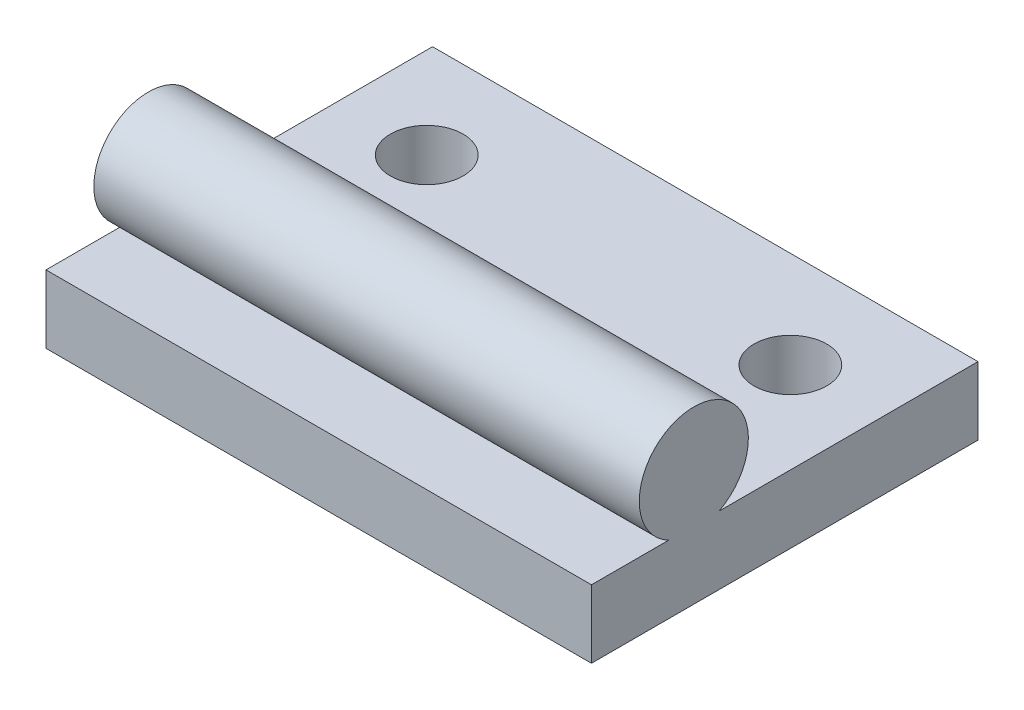
ISO-10303-21;
HEADER;
FILE_DESCRIPTION(('STEP AP214'),'2;1');
FILE_NAME('part.step','',(''),(''),'','','');
FILE_SCHEMA(('AUTOMOTIVE_DESIGN { 1 0 10303 214 1 1 1 1 }'));
ENDSEC;
DATA;
#1=APPLICATION_CONTEXT('core data for automotive mechanical design processes');
#2=APPLICATION_PROTOCOL_DEFINITION('international standard','automotive_design',2000,#1);
#3=PRODUCT_CONTEXT('',#1,'mechanical');
#4=PRODUCT('Part','Part','',(#3));
#5=PRODUCT_RELATED_PRODUCT_CATEGORY('part','',(#4));
#6=PRODUCT_DEFINITION_FORMATION('','',#4);
#7=PRODUCT_DEFINITION_CONTEXT('part definition',#1,'design');
#8=PRODUCT_DEFINITION('design','',#6,#7);
#9=PRODUCT_DEFINITION_SHAPE('','',#8);
#10=(LENGTH_UNIT() NAMED_UNIT(*) SI_UNIT(.MILLI.,.METRE.));
#11=(NAMED_UNIT(*) PLANE_ANGLE_UNIT() SI_UNIT($,.RADIAN.));
#12=(NAMED_UNIT(*) SI_UNIT($,.STERADIAN.) SOLID_ANGLE_UNIT());
#13=UNCERTAINTY_MEASURE_WITH_UNIT(LENGTH_MEASURE(1.E-05),#10,'distance_accuracy_value','');
#14=(GEOMETRIC_REPRESENTATION_CONTEXT(3) GLOBAL_UNCERTAINTY_ASSIGNED_CONTEXT((#13)) GLOBAL_UNIT_ASSIGNED_CONTEXT((#10,
#11,#12)) REPRESENTATION_CONTEXT('',''));
#15=CARTESIAN_POINT('',(0.,0.,0.));
#16=DIRECTION('',(0.,0.,1.));
#17=DIRECTION('',(1.,0.,0.));
#18=AXIS2_PLACEMENT_3D('',#15,#16,#17);
#19=CARTESIAN_POINT('',(0.,4.7498,0.));
#20=DIRECTION('',(0.,-1.,0.));
#21=DIRECTION('',(0.,0.,-1.));
#22=AXIS2_PLACEMENT_3D('',#19,#20,#21);
#23=PLANE('',#22);
#24=DIRECTION('',(0.,0.,-1.));
#25=VECTOR('',#24,1.);
#26=CARTESIAN_POINT('',(38.1,4.7498,0.));
#27=LINE('',#26,#25);
#28=CARTESIAN_POINT('',(38.1,4.7498,14.3002));
#29=VERTEX_POINT('',#28);
#30=CARTESIAN_POINT('',(38.1,4.7498,8.9120505477311));
#31=VERTEX_POINT('',#30);
#32=EDGE_CURVE('E58',#29,#31,#27,.T.);
#33=ORIENTED_EDGE('',*,*,#32,.T.);
#34=DIRECTION('',(-1.,0.,0.));
#35=VECTOR('',#34,1.);
#36=CARTESIAN_POINT('',(48.876307345283,4.7498,8.9120505477311));
#37=LINE('',#36,#35);
#38=CARTESIAN_POINT('',(0.,4.7498,8.91205054773111));
#39=VERTEX_POINT('',#38);
#40=EDGE_CURVE('E11',#31,#39,#37,.T.);
#41=ORIENTED_EDGE('',*,*,#40,.T.);
#42=DIRECTION('',(0.,0.,1.));
#43=VECTOR('',#42,1.);
#44=CARTESIAN_POINT('',(0.,4.7498,0.));
#45=LINE('',#44,#43);
#46=CARTESIAN_POINT('',(0.,4.7498,14.3002));
#47=VERTEX_POINT('',#46);
#48=EDGE_CURVE('E196',#39,#47,#45,.T.);
#49=ORIENTED_EDGE('',*,*,#48,.T.);
#50=DIRECTION('',(-1.,0.,0.));
#51=VECTOR('',#50,1.);
#52=CARTESIAN_POINT('',(0.,4.7498,14.3002));
#53=LINE('',#52,#51);
#54=EDGE_CURVE('E129',#29,#47,#53,.T.);
#55=ORIENTED_EDGE('',*,*,#54,.F.);
#56=EDGE_LOOP('',(#33,#41,#49,#55));
#57=FACE_BOUND('',#56,.T.);
#58=ADVANCED_FACE('F44',(#57),#23,.F.);
#59=CARTESIAN_POINT('',(0.,4.7498,0.));
#60=DIRECTION('',(1.,0.,0.));
#61=DIRECTION('',(0.,0.,-1.));
#62=AXIS2_PLACEMENT_3D('',#59,#60,#61);
#63=PLANE('',#62);
#64=ORIENTED_EDGE('',*,*,#48,.F.);
#65=CARTESIAN_POINT('',(0.,8.12791045813337,7.1501));
#66=DIRECTION('',(-1.,0.,0.));
#67=DIRECTION('',(0.,0.,1.));
#68=AXIS2_PLACEMENT_3D('',#65,#66,#67);
#69=CIRCLE('',#68,3.81);
#70=CARTESIAN_POINT('',(0.,4.7498,5.38814945226889));
#71=VERTEX_POINT('',#70);
#72=EDGE_CURVE('E118',#39,#71,#69,.T.);
#73=ORIENTED_EDGE('',*,*,#72,.T.);
#74=CARTESIAN_POINT('',(0.,4.7498,-12.7));
#75=VERTEX_POINT('',#74);
#76=EDGE_CURVE('E108',#75,#71,#45,.T.);
#77=ORIENTED_EDGE('',*,*,#76,.F.);
#78=DIRECTION('',(0.,-1.,0.));
#79=VECTOR('',#78,1.);
#80=CARTESIAN_POINT('',(0.,4.7498,-12.7));
#81=LINE('',#80,#79);
#82=CARTESIAN_POINT('',(0.,0.,-12.7));
#83=VERTEX_POINT('',#82);
#84=EDGE_CURVE('E206',#75,#83,#81,.T.);
#85=ORIENTED_EDGE('',*,*,#84,.T.);
#86=DIRECTION('',(0.,0.,1.));
#87=VECTOR('',#86,1.);
#88=CARTESIAN_POINT('',(0.,0.,0.));
#89=LINE('',#88,#87);
#90=CARTESIAN_POINT('',(0.,-5.96945777522548E-05,0.));
#91=VERTEX_POINT('',#90);
#92=EDGE_CURVE('E182',#83,#91,#89,.T.);
#93=ORIENTED_EDGE('',*,*,#92,.T.);
#94=DIRECTION('',(0.,0.,-1.));
#95=VECTOR('',#94,1.);
#96=CARTESIAN_POINT('',(0.,-0.00011938915550451,14.3002));
#97=LINE('',#96,#95);
#98=CARTESIAN_POINT('',(0.,-0.00011938915550451,14.3002));
#99=VERTEX_POINT('',#98);
#100=EDGE_CURVE('E145',#99,#91,#97,.T.);
#101=ORIENTED_EDGE('',*,*,#100,.F.);
#102=DIRECTION('',(0.,-1.,0.));
#103=VECTOR('',#102,1.);
#104=CARTESIAN_POINT('',(0.,4.7498,14.3002));
#105=LINE('',#104,#103);
#106=EDGE_CURVE('E117',#47,#99,#105,.T.);
#107=ORIENTED_EDGE('',*,*,#106,.F.);
#108=EDGE_LOOP('',(#64,#73,#77,#85,#93,#101,#107));
#109=FACE_BOUND('',#108,.T.);
#110=ADVANCED_FACE('F46',(#109),#63,.F.);
#111=CARTESIAN_POINT('',(38.1,4.7498,0.));
#112=DIRECTION('',(-1.,0.,0.));
#113=DIRECTION('',(0.,0.,1.));
#114=AXIS2_PLACEMENT_3D('',#111,#112,#113);
#115=PLANE('',#114);
#116=CARTESIAN_POINT('',(38.1,4.7498,5.38814945226889));
#117=VERTEX_POINT('',#116);
#118=CARTESIAN_POINT('',(38.1,4.7498,-12.7));
#119=VERTEX_POINT('',#118);
#120=EDGE_CURVE('E99',#117,#119,#27,.T.);
#121=ORIENTED_EDGE('',*,*,#120,.F.);
#122=CARTESIAN_POINT('',(38.1,8.12791045813337,7.15009999999999));
#123=DIRECTION('',(-1.,0.,0.));
#124=DIRECTION('',(0.,0.,1.));
#125=AXIS2_PLACEMENT_3D('',#122,#123,#124);
#126=CIRCLE('',#125,3.81);
#127=EDGE_CURVE('E103',#117,#31,#126,.F.);
#128=ORIENTED_EDGE('',*,*,#127,.T.);
#129=ORIENTED_EDGE('',*,*,#32,.F.);
#130=DIRECTION('',(0.,1.,0.));
#131=VECTOR('',#130,1.);
#132=CARTESIAN_POINT('',(38.1,4.7498,14.3002));
#133=LINE('',#132,#131);
#134=CARTESIAN_POINT('',(38.1,-0.00011938915550451,14.3002));
#135=VERTEX_POINT('',#134);
#136=EDGE_CURVE('E126',#135,#29,#133,.T.);
#137=ORIENTED_EDGE('',*,*,#136,.F.);
#138=DIRECTION('',(0.,0.,-1.));
#139=VECTOR('',#138,1.);
#140=CARTESIAN_POINT('',(38.1,-0.00011938915550451,14.3002));
#141=LINE('',#140,#139);
#142=CARTESIAN_POINT('',(38.1,-5.96945777522548E-05,0.));
#143=VERTEX_POINT('',#142);
#144=EDGE_CURVE('E132',#135,#143,#141,.T.);
#145=ORIENTED_EDGE('',*,*,#144,.T.);
#146=DIRECTION('',(0.,0.,-1.));
#147=VECTOR('',#146,1.);
#148=CARTESIAN_POINT('',(38.1,0.,0.));
#149=LINE('',#148,#147);
#150=CARTESIAN_POINT('',(38.1,0.,-12.7));
#151=VERTEX_POINT('',#150);
#152=EDGE_CURVE('E192',#143,#151,#149,.T.);
#153=ORIENTED_EDGE('',*,*,#152,.T.);
#154=DIRECTION('',(0.,-1.,0.));
#155=VECTOR('',#154,1.);
#156=CARTESIAN_POINT('',(38.1,4.7498,-12.7));
#157=LINE('',#156,#155);
#158=EDGE_CURVE('E105',#119,#151,#157,.T.);
#159=ORIENTED_EDGE('',*,*,#158,.F.);
#160=EDGE_LOOP('',(#121,#128,#129,#137,#145,#153,#159));
#161=FACE_BOUND('',#160,.T.);
#162=ADVANCED_FACE('F101',(#161),#115,.F.);
#163=CARTESIAN_POINT('',(0.,4.7498,-12.7));
#164=DIRECTION('',(0.,0.,1.));
#165=DIRECTION('',(1.,0.,0.));
#166=AXIS2_PLACEMENT_3D('',#163,#164,#165);
#167=PLANE('',#166);
#168=DIRECTION('',(-1.,0.,0.));
#169=VECTOR('',#168,1.);
#170=CARTESIAN_POINT('',(0.,0.,-12.7));
#171=LINE('',#170,#169);
#172=EDGE_CURVE('E194',#151,#83,#171,.T.);
#173=ORIENTED_EDGE('',*,*,#172,.T.);
#174=ORIENTED_EDGE('',*,*,#84,.F.);
#175=DIRECTION('',(-1.,0.,0.));
#176=VECTOR('',#175,1.);
#177=CARTESIAN_POINT('',(0.,4.7498,-12.7));
#178=LINE('',#177,#176);
#179=EDGE_CURVE('E205',#119,#75,#178,.T.);
#180=ORIENTED_EDGE('',*,*,#179,.F.);
#181=ORIENTED_EDGE('',*,*,#158,.T.);
#182=EDGE_LOOP('',(#173,#174,#180,#181));
#183=FACE_BOUND('',#182,.T.);
#184=ADVANCED_FACE('F170',(#183),#167,.F.);
#185=CARTESIAN_POINT('',(6.35,4.7498,-5.9436));
#186=DIRECTION('',(0.,1.,0.));
#187=DIRECTION('',(0.,0.,1.));
#188=AXIS2_PLACEMENT_3D('',#185,#186,#187);
#189=CIRCLE('',#188,2.54);
#190=CARTESIAN_POINT('',(6.35,4.7498,-3.4036));
#191=VERTEX_POINT('',#190);
#192=EDGE_CURVE('E219',#191,#191,#189,.T.);
#193=ORIENTED_EDGE('',*,*,#192,.F.);
#194=EDGE_LOOP('',(#193));
#195=FACE_BOUND('',#194,.T.);
#196=CARTESIAN_POINT('',(31.75,4.7498,-5.94360000000001));
#197=DIRECTION('',(0.,1.,0.));
#198=DIRECTION('',(0.,0.,1.));
#199=AXIS2_PLACEMENT_3D('',#196,#197,#198);
#200=CIRCLE('',#199,2.54);
#201=CARTESIAN_POINT('',(31.75,4.7498,-3.4036));
#202=VERTEX_POINT('',#201);
#203=EDGE_CURVE('E216',#202,#202,#200,.T.);
#204=ORIENTED_EDGE('',*,*,#203,.F.);
#205=EDGE_LOOP('',(#204));
#206=FACE_BOUND('',#205,.T.);
#207=ORIENTED_EDGE('',*,*,#76,.T.);
#208=DIRECTION('',(-1.,0.,0.));
#209=VECTOR('',#208,1.);
#210=CARTESIAN_POINT('',(48.876307345283,4.7498,5.38814945226889));
#211=LINE('',#210,#209);
#212=EDGE_CURVE('E52',#71,#117,#211,.F.);
#213=ORIENTED_EDGE('',*,*,#212,.T.);
#214=ORIENTED_EDGE('',*,*,#120,.T.);
#215=ORIENTED_EDGE('',*,*,#179,.T.);
#216=EDGE_LOOP('',(#207,#213,#214,#215));
#217=FACE_BOUND('',#216,.T.);
#218=ADVANCED_FACE('F111',(#195,#206,#217),#23,.F.);
#219=CARTESIAN_POINT('',(0.,0.,0.));
#220=DIRECTION('',(0.,-1.,0.));
#221=DIRECTION('',(0.,0.,-1.));
#222=AXIS2_PLACEMENT_3D('',#219,#220,#221);
#223=PLANE('',#222);
#224=CARTESIAN_POINT('',(6.35,0.,-5.9436));
#225=DIRECTION('',(0.,1.,0.));
#226=DIRECTION('',(0.,0.,1.));
#227=AXIS2_PLACEMENT_3D('',#224,#225,#226);
#228=CIRCLE('',#227,2.54);
#229=CARTESIAN_POINT('',(6.35,0.,-3.4036));
#230=VERTEX_POINT('',#229);
#231=EDGE_CURVE('E189',#230,#230,#228,.T.);
#232=ORIENTED_EDGE('',*,*,#231,.T.);
#233=EDGE_LOOP('',(#232));
#234=FACE_BOUND('',#233,.T.);
#235=CARTESIAN_POINT('',(31.75,0.,-5.94360000000001));
#236=DIRECTION('',(0.,1.,0.));
#237=DIRECTION('',(0.,0.,1.));
#238=AXIS2_PLACEMENT_3D('',#235,#236,#237);
#239=CIRCLE('',#238,2.54);
#240=CARTESIAN_POINT('',(31.75,0.,-3.4036));
#241=VERTEX_POINT('',#240);
#242=EDGE_CURVE('E213',#241,#241,#239,.T.);
#243=ORIENTED_EDGE('',*,*,#242,.T.);
#244=EDGE_LOOP('',(#243));
#245=FACE_BOUND('',#244,.T.);
#246=ORIENTED_EDGE('',*,*,#92,.F.);
#247=ORIENTED_EDGE('',*,*,#172,.F.);
#248=ORIENTED_EDGE('',*,*,#152,.F.);
#249=CARTESIAN_POINT('',(0.,-0.00011938915550451,0.));
#250=DIRECTION('',(1.,0.,0.));
#251=VECTOR('',#250,1.);
#252=LINE('',#249,#251);
#253=EDGE_CURVE('E139',#91,#143,#252,.T.);
#254=ORIENTED_EDGE('',*,*,#253,.F.);
#255=EDGE_LOOP('',(#246,#247,#248,#254));
#256=FACE_BOUND('',#255,.T.);
#257=ADVANCED_FACE('F166',(#234,#245,#256),#223,.T.);
#258=CARTESIAN_POINT('',(31.75,0.,-5.94360000000001));
#259=DIRECTION('',(0.,1.,0.));
#260=DIRECTION('',(0.,0.,1.));
#261=AXIS2_PLACEMENT_3D('',#258,#259,#260);
#262=CYLINDRICAL_SURFACE('',#261,2.54);
#263=ORIENTED_EDGE('',*,*,#242,.F.);
#264=EDGE_LOOP('',(#263));
#265=FACE_BOUND('',#264,.T.);
#266=ORIENTED_EDGE('',*,*,#203,.T.);
#267=EDGE_LOOP('',(#266));
#268=FACE_BOUND('',#267,.T.);
#269=ADVANCED_FACE('F162',(#265,#268),#262,.F.);
#270=CARTESIAN_POINT('',(6.35,0.,-5.9436));
#271=DIRECTION('',(0.,1.,0.));
#272=DIRECTION('',(0.,0.,1.));
#273=AXIS2_PLACEMENT_3D('',#270,#271,#272);
#274=CYLINDRICAL_SURFACE('',#273,2.54);
#275=ORIENTED_EDGE('',*,*,#231,.F.);
#276=EDGE_LOOP('',(#275));
#277=FACE_BOUND('',#276,.T.);
#278=ORIENTED_EDGE('',*,*,#192,.T.);
#279=EDGE_LOOP('',(#278));
#280=FACE_BOUND('',#279,.T.);
#281=ADVANCED_FACE('F158',(#277,#280),#274,.F.);
#282=CARTESIAN_POINT('',(0.,-0.00011938915550451,14.3002));
#283=DIRECTION('',(0.,1.,0.));
#284=DIRECTION('',(0.,0.,1.));
#285=AXIS2_PLACEMENT_3D('',#282,#283,#284);
#286=PLANE('',#285);
#287=ORIENTED_EDGE('',*,*,#253,.T.);
#288=ORIENTED_EDGE('',*,*,#144,.F.);
#289=DIRECTION('',(1.,0.,0.));
#290=VECTOR('',#289,1.);
#291=CARTESIAN_POINT('',(0.,-0.00011938915550451,14.3002));
#292=LINE('',#291,#290);
#293=EDGE_CURVE('E121',#99,#135,#292,.T.);
#294=ORIENTED_EDGE('',*,*,#293,.F.);
#295=ORIENTED_EDGE('',*,*,#100,.T.);
#296=EDGE_LOOP('',(#287,#288,#294,#295));
#297=FACE_BOUND('',#296,.T.);
#298=ADVANCED_FACE('F147',(#297),#286,.F.);
#299=CARTESIAN_POINT('',(0.,0.,14.3002));
#300=DIRECTION('',(0.,0.,1.));
#301=DIRECTION('',(1.,0.,0.));
#302=AXIS2_PLACEMENT_3D('',#299,#300,#301);
#303=PLANE('',#302);
#304=ORIENTED_EDGE('',*,*,#106,.T.);
#305=ORIENTED_EDGE('',*,*,#293,.T.);
#306=ORIENTED_EDGE('',*,*,#136,.T.);
#307=ORIENTED_EDGE('',*,*,#54,.T.);
#308=EDGE_LOOP('',(#304,#305,#306,#307));
#309=FACE_BOUND('',#308,.T.);
#310=ADVANCED_FACE('F157',(#309),#303,.T.);
#311=CARTESIAN_POINT('',(48.876307345283,8.12791045813337,7.15009999999999));
#312=DIRECTION('',(-1.,0.,0.));
#313=DIRECTION('',(0.,0.,1.));
#314=AXIS2_PLACEMENT_3D('',#311,#312,#313);
#315=CYLINDRICAL_SURFACE('',#314,3.81);
#316=ORIENTED_EDGE('',*,*,#40,.F.);
#317=ORIENTED_EDGE('',*,*,#127,.F.);
#318=ORIENTED_EDGE('',*,*,#212,.F.);
#319=ORIENTED_EDGE('',*,*,#72,.F.);
#320=EDGE_LOOP('',(#316,#317,#318,#319));
#321=FACE_BOUND('',#320,.T.);
#322=ADVANCED_FACE('F116',(#321),#315,.T.);
#323=CLOSED_SHELL('',(#58,#110,#162,#184,#218,#257,#269,#281,#298,#310,#322));
#324=MANIFOLD_SOLID_BREP('B2',#323);
#325=ADVANCED_BREP_SHAPE_REPRESENTATION('',(#18,#324),#14);
#326=SHAPE_DEFINITION_REPRESENTATION(#9,#325);
ENDSEC;
END-ISO-10303-21;
